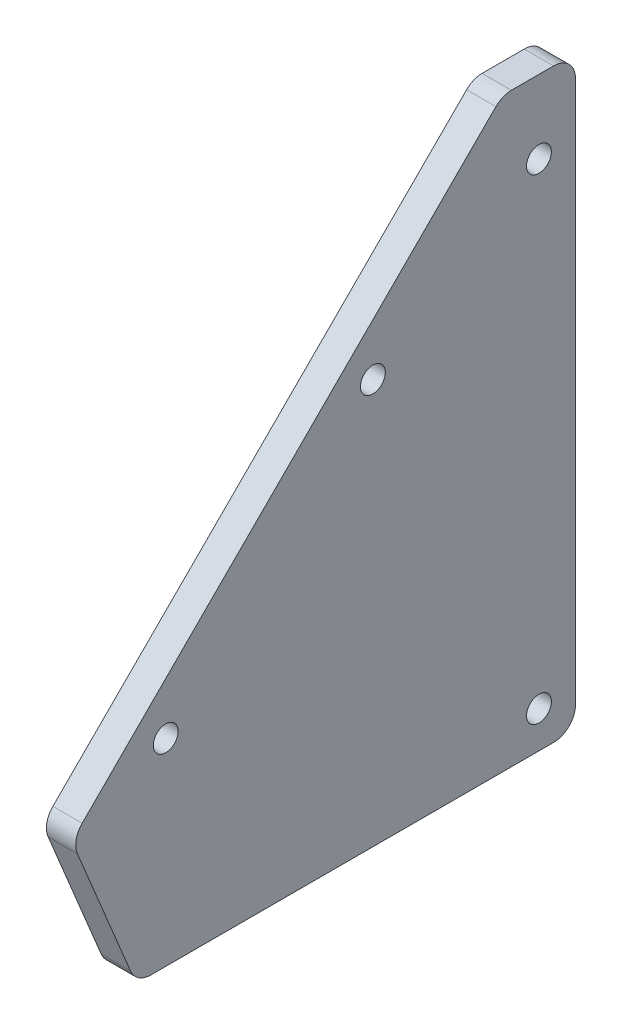
ISO-10303-21;
HEADER;
FILE_DESCRIPTION(('STEP AP214'),'2;1');
FILE_NAME('part.step','',(''),(''),'','','');
FILE_SCHEMA(('AUTOMOTIVE_DESIGN { 1 0 10303 214 1 1 1 1 }'));
ENDSEC;
DATA;
#1=APPLICATION_CONTEXT('core data for automotive mechanical design processes');
#2=APPLICATION_PROTOCOL_DEFINITION('international standard','automotive_design',2000,#1);
#3=PRODUCT_CONTEXT('',#1,'mechanical');
#4=PRODUCT('Part','Part','',(#3));
#5=PRODUCT_RELATED_PRODUCT_CATEGORY('part','',(#4));
#6=PRODUCT_DEFINITION_FORMATION('','',#4);
#7=PRODUCT_DEFINITION_CONTEXT('part definition',#1,'design');
#8=PRODUCT_DEFINITION('design','',#6,#7);
#9=PRODUCT_DEFINITION_SHAPE('','',#8);
#10=(LENGTH_UNIT() NAMED_UNIT(*) SI_UNIT(.MILLI.,.METRE.));
#11=(NAMED_UNIT(*) PLANE_ANGLE_UNIT() SI_UNIT($,.RADIAN.));
#12=(NAMED_UNIT(*) SI_UNIT($,.STERADIAN.) SOLID_ANGLE_UNIT());
#13=UNCERTAINTY_MEASURE_WITH_UNIT(LENGTH_MEASURE(1.E-05),#10,'distance_accuracy_value','');
#14=(GEOMETRIC_REPRESENTATION_CONTEXT(3) GLOBAL_UNCERTAINTY_ASSIGNED_CONTEXT((#13)) GLOBAL_UNIT_ASSIGNED_CONTEXT((#10,
#11,#12)) REPRESENTATION_CONTEXT('',''));
#15=CARTESIAN_POINT('',(0.,0.,0.));
#16=DIRECTION('',(0.,0.,1.));
#17=DIRECTION('',(1.,0.,0.));
#18=AXIS2_PLACEMENT_3D('',#15,#16,#17);
#19=CARTESIAN_POINT('',(4.,0.,0.));
#20=DIRECTION('',(1.,0.,0.));
#21=DIRECTION('',(0.,0.,-1.));
#22=AXIS2_PLACEMENT_3D('',#19,#20,#21);
#23=PLANE('',#22);
#24=CARTESIAN_POINT('',(4.,70.,-85.0000000000008));
#25=DIRECTION('',(1.,0.,0.));
#26=DIRECTION('',(0.,0.,-1.));
#27=AXIS2_PLACEMENT_3D('',#24,#25,#26);
#28=CIRCLE('',#27,1.7);
#29=CARTESIAN_POINT('',(4.,70.,-86.7000000000008));
#30=VERTEX_POINT('',#29);
#31=EDGE_CURVE('E387',#30,#30,#28,.T.);
#32=ORIENTED_EDGE('',*,*,#31,.F.);
#33=EDGE_LOOP('',(#32));
#34=FACE_BOUND('',#33,.T.);
#35=CARTESIAN_POINT('',(4.,55.2512626584709,-62.322330470337));
#36=DIRECTION('',(1.,0.,0.));
#37=DIRECTION('',(0.,0.,-1.));
#38=AXIS2_PLACEMENT_3D('',#35,#36,#37);
#39=CIRCLE('',#38,1.70000000000002);
#40=CARTESIAN_POINT('',(4.,55.2512626584709,-64.0223304703371));
#41=VERTEX_POINT('',#40);
#42=EDGE_CURVE('E155',#41,#41,#39,.T.);
#43=ORIENTED_EDGE('',*,*,#42,.F.);
#44=EDGE_LOOP('',(#43));
#45=FACE_BOUND('',#44,.T.);
#46=DIRECTION('',(0.,0.,1.));
#47=VECTOR('',#46,1.);
#48=CARTESIAN_POINT('',(4.,80.,-80.0000000000008));
#49=LINE('',#48,#47);
#50=CARTESIAN_POINT('',(4.,80.,-87.0000000000008));
#51=VERTEX_POINT('',#50);
#52=CARTESIAN_POINT('',(4.,80.,-81.2426406871201));
#53=VERTEX_POINT('',#52);
#54=EDGE_CURVE('E163',#51,#53,#49,.T.);
#55=ORIENTED_EDGE('',*,*,#54,.T.);
#56=CARTESIAN_POINT('',(4.,77.,-81.2426406871201));
#57=DIRECTION('',(1.,0.,0.));
#58=DIRECTION('',(0.,0.,-1.));
#59=AXIS2_PLACEMENT_3D('',#56,#57,#58);
#60=CIRCLE('',#59,3.);
#61=CARTESIAN_POINT('',(4.,79.1213203435596,-79.1213203435605));
#62=VERTEX_POINT('',#61);
#63=EDGE_CURVE('E189',#53,#62,#60,.T.);
#64=ORIENTED_EDGE('',*,*,#63,.T.);
#65=DIRECTION('',(0.,-0.707106781186544,0.707106781186551));
#66=VECTOR('',#65,1.);
#67=CARTESIAN_POINT('',(4.,80.,-80.0000000000008));
#68=LINE('',#67,#66);
#69=CARTESIAN_POINT('',(4.,22.6306243733465,-22.6306243733468));
#70=VERTEX_POINT('',#69);
#71=EDGE_CURVE('E145',#62,#70,#68,.T.);
#72=ORIENTED_EDGE('',*,*,#71,.T.);
#73=CARTESIAN_POINT('',(4.,20.5093040297869,-24.7519447169064));
#74=DIRECTION('',(1.,0.,0.));
#75=DIRECTION('',(0.,0.,-1.));
#76=AXIS2_PLACEMENT_3D('',#73,#74,#75);
#77=CIRCLE('',#76,3.);
#78=CARTESIAN_POINT('',(4.,19.3612537326916,-21.9803061193725));
#79=VERTEX_POINT('',#78);
#80=EDGE_CURVE('E185',#70,#79,#77,.T.);
#81=ORIENTED_EDGE('',*,*,#80,.T.);
#82=DIRECTION('',(0.,0.923879532511288,0.382683432365088));
#83=VECTOR('',#82,1.);
#84=CARTESIAN_POINT('',(4.,10.6066017177982,-25.6066017177983));
#85=LINE('',#84,#83);
#86=CARTESIAN_POINT('',(4.,1.85194970290474,-29.2328973162241));
#87=VERTEX_POINT('',#86);
#88=EDGE_CURVE('E169',#79,#87,#85,.F.);
#89=ORIENTED_EDGE('',*,*,#88,.T.);
#90=CARTESIAN_POINT('',(4.,3.,-32.0045359137579));
#91=DIRECTION('',(1.,0.,0.));
#92=DIRECTION('',(0.,0.,-1.));
#93=AXIS2_PLACEMENT_3D('',#90,#91,#92);
#94=CIRCLE('',#93,3.);
#95=CARTESIAN_POINT('',(4.,0.,-32.0045359137579));
#96=VERTEX_POINT('',#95);
#97=EDGE_CURVE('E183',#87,#96,#94,.T.);
#98=ORIENTED_EDGE('',*,*,#97,.T.);
#99=DIRECTION('',(0.,0.,-1.));
#100=VECTOR('',#99,1.);
#101=CARTESIAN_POINT('',(4.,0.,0.));
#102=LINE('',#101,#100);
#103=CARTESIAN_POINT('',(4.,0.,-87.0000000000009));
#104=VERTEX_POINT('',#103);
#105=EDGE_CURVE('E209',#96,#104,#102,.T.);
#106=ORIENTED_EDGE('',*,*,#105,.T.);
#107=CARTESIAN_POINT('',(4.,3.,-87.0000000000009));
#108=DIRECTION('',(1.,0.,0.));
#109=DIRECTION('',(0.,0.,-1.));
#110=AXIS2_PLACEMENT_3D('',#107,#108,#109);
#111=CIRCLE('',#110,3.);
#112=CARTESIAN_POINT('',(4.,3.,-90.0000000000009));
#113=VERTEX_POINT('',#112);
#114=EDGE_CURVE('E63',#104,#113,#111,.T.);
#115=ORIENTED_EDGE('',*,*,#114,.T.);
#116=DIRECTION('',(0.,1.,0.));
#117=VECTOR('',#116,1.);
#118=CARTESIAN_POINT('',(4.,80.,-90.0000000000008));
#119=LINE('',#118,#117);
#120=CARTESIAN_POINT('',(4.,77.,-90.0000000000008));
#121=VERTEX_POINT('',#120);
#122=EDGE_CURVE('E212',#113,#121,#119,.T.);
#123=ORIENTED_EDGE('',*,*,#122,.T.);
#124=CARTESIAN_POINT('',(4.,77.,-87.0000000000008));
#125=DIRECTION('',(1.,0.,0.));
#126=DIRECTION('',(0.,0.,-1.));
#127=AXIS2_PLACEMENT_3D('',#124,#125,#126);
#128=CIRCLE('',#127,3.);
#129=EDGE_CURVE('E187',#121,#51,#128,.T.);
#130=ORIENTED_EDGE('',*,*,#129,.T.);
#131=EDGE_LOOP('',(#55,#64,#72,#81,#89,#98,#106,#115,#123,#130));
#132=FACE_BOUND('',#131,.T.);
#133=CARTESIAN_POINT('',(4.,5.,-85.0000000000009));
#134=DIRECTION('',(1.,0.,0.));
#135=DIRECTION('',(0.,0.,-1.));
#136=AXIS2_PLACEMENT_3D('',#133,#134,#135);
#137=CIRCLE('',#136,1.7);
#138=CARTESIAN_POINT('',(4.,5.,-86.7000000000008));
#139=VERTEX_POINT('',#138);
#140=EDGE_CURVE('E379',#139,#139,#137,.T.);
#141=ORIENTED_EDGE('',*,*,#140,.F.);
#142=EDGE_LOOP('',(#141));
#143=FACE_BOUND('',#142,.T.);
#144=CARTESIAN_POINT('',(4.,26.9669914110092,-34.038059222875));
#145=DIRECTION('',(1.,0.,0.));
#146=DIRECTION('',(0.,0.,-1.));
#147=AXIS2_PLACEMENT_3D('',#144,#145,#146);
#148=CIRCLE('',#147,1.70000000000002);
#149=CARTESIAN_POINT('',(4.,26.9669914110092,-35.738059222875));
#150=VERTEX_POINT('',#149);
#151=EDGE_CURVE('E395',#150,#150,#148,.T.);
#152=ORIENTED_EDGE('',*,*,#151,.F.);
#153=EDGE_LOOP('',(#152));
#154=FACE_BOUND('',#153,.T.);
#155=ADVANCED_FACE('F43',(#34,#45,#132,#143,#154),#23,.T.);
#156=CARTESIAN_POINT('',(0.,0.,0.));
#157=DIRECTION('',(1.,0.,0.));
#158=DIRECTION('',(0.,0.,-1.));
#159=AXIS2_PLACEMENT_3D('',#156,#157,#158);
#160=PLANE('',#159);
#161=DIRECTION('',(0.,-0.707106781186544,0.707106781186551));
#162=VECTOR('',#161,1.);
#163=CARTESIAN_POINT('',(0.,80.,-80.0000000000008));
#164=LINE('',#163,#162);
#165=CARTESIAN_POINT('',(0.,79.1213203435596,-79.1213203435605));
#166=VERTEX_POINT('',#165);
#167=CARTESIAN_POINT('',(0.,22.6306243733465,-22.6306243733468));
#168=VERTEX_POINT('',#167);
#169=EDGE_CURVE('E137',#166,#168,#164,.T.);
#170=ORIENTED_EDGE('',*,*,#169,.F.);
#171=CARTESIAN_POINT('',(0.,77.,-81.2426406871201));
#172=DIRECTION('',(1.,0.,0.));
#173=DIRECTION('',(0.,0.,-1.));
#174=AXIS2_PLACEMENT_3D('',#171,#172,#173);
#175=CIRCLE('',#174,3.);
#176=CARTESIAN_POINT('',(0.,80.,-81.2426406871201));
#177=VERTEX_POINT('',#176);
#178=EDGE_CURVE('E122',#166,#177,#175,.F.);
#179=ORIENTED_EDGE('',*,*,#178,.T.);
#180=DIRECTION('',(0.,0.,1.));
#181=VECTOR('',#180,1.);
#182=CARTESIAN_POINT('',(0.,80.,-80.0000000000008));
#183=LINE('',#182,#181);
#184=CARTESIAN_POINT('',(0.,80.,-87.0000000000008));
#185=VERTEX_POINT('',#184);
#186=EDGE_CURVE('E164',#185,#177,#183,.T.);
#187=ORIENTED_EDGE('',*,*,#186,.F.);
#188=CARTESIAN_POINT('',(0.,77.,-87.0000000000008));
#189=DIRECTION('',(1.,0.,0.));
#190=DIRECTION('',(0.,0.,-1.));
#191=AXIS2_PLACEMENT_3D('',#188,#189,#190);
#192=CIRCLE('',#191,3.);
#193=CARTESIAN_POINT('',(0.,77.,-90.0000000000008));
#194=VERTEX_POINT('',#193);
#195=EDGE_CURVE('E135',#185,#194,#192,.F.);
#196=ORIENTED_EDGE('',*,*,#195,.T.);
#197=DIRECTION('',(0.,1.,0.));
#198=VECTOR('',#197,1.);
#199=CARTESIAN_POINT('',(0.,80.,-90.0000000000008));
#200=LINE('',#199,#198);
#201=CARTESIAN_POINT('',(0.,3.,-90.0000000000009));
#202=VERTEX_POINT('',#201);
#203=EDGE_CURVE('E151',#202,#194,#200,.T.);
#204=ORIENTED_EDGE('',*,*,#203,.F.);
#205=CARTESIAN_POINT('',(0.,3.,-87.0000000000009));
#206=DIRECTION('',(1.,0.,0.));
#207=DIRECTION('',(0.,0.,-1.));
#208=AXIS2_PLACEMENT_3D('',#205,#206,#207);
#209=CIRCLE('',#208,3.);
#210=CARTESIAN_POINT('',(0.,0.,-87.0000000000009));
#211=VERTEX_POINT('',#210);
#212=EDGE_CURVE('E141',#202,#211,#209,.F.);
#213=ORIENTED_EDGE('',*,*,#212,.T.);
#214=DIRECTION('',(0.,0.,-1.));
#215=VECTOR('',#214,1.);
#216=CARTESIAN_POINT('',(0.,0.,-90.0000000000009));
#217=LINE('',#216,#215);
#218=CARTESIAN_POINT('',(0.,0.,-32.0045359137579));
#219=VERTEX_POINT('',#218);
#220=EDGE_CURVE('E152',#219,#211,#217,.T.);
#221=ORIENTED_EDGE('',*,*,#220,.F.);
#222=CARTESIAN_POINT('',(0.,3.,-32.0045359137579));
#223=DIRECTION('',(1.,0.,0.));
#224=DIRECTION('',(0.,0.,-1.));
#225=AXIS2_PLACEMENT_3D('',#222,#223,#224);
#226=CIRCLE('',#225,3.);
#227=CARTESIAN_POINT('',(0.,1.85194970290474,-29.2328973162241));
#228=VERTEX_POINT('',#227);
#229=EDGE_CURVE('E174',#219,#228,#226,.F.);
#230=ORIENTED_EDGE('',*,*,#229,.T.);
#231=DIRECTION('',(0.,-0.923879532511288,-0.382683432365088));
#232=VECTOR('',#231,1.);
#233=CARTESIAN_POINT('',(0.,0.,-30.));
#234=LINE('',#233,#232);
#235=CARTESIAN_POINT('',(0.,19.3612537326916,-21.9803061193725));
#236=VERTEX_POINT('',#235);
#237=EDGE_CURVE('E170',#228,#236,#234,.F.);
#238=ORIENTED_EDGE('',*,*,#237,.T.);
#239=CARTESIAN_POINT('',(0.,20.5093040297869,-24.7519447169064));
#240=DIRECTION('',(1.,0.,0.));
#241=DIRECTION('',(0.,0.,-1.));
#242=AXIS2_PLACEMENT_3D('',#239,#240,#241);
#243=CIRCLE('',#242,3.);
#244=EDGE_CURVE('E148',#236,#168,#243,.F.);
#245=ORIENTED_EDGE('',*,*,#244,.T.);
#246=EDGE_LOOP('',(#170,#179,#187,#196,#204,#213,#221,#230,#238,#245));
#247=FACE_BOUND('',#246,.T.);
#248=CARTESIAN_POINT('',(0.,55.2512626584709,-62.322330470337));
#249=DIRECTION('',(1.,0.,0.));
#250=DIRECTION('',(0.,0.,-1.));
#251=AXIS2_PLACEMENT_3D('',#248,#249,#250);
#252=CIRCLE('',#251,1.70000000000002);
#253=CARTESIAN_POINT('',(0.,55.2512626584709,-64.0223304703371));
#254=VERTEX_POINT('',#253);
#255=EDGE_CURVE('E158',#254,#254,#252,.T.);
#256=ORIENTED_EDGE('',*,*,#255,.T.);
#257=EDGE_LOOP('',(#256));
#258=FACE_BOUND('',#257,.T.);
#259=CARTESIAN_POINT('',(0.,5.,-85.0000000000009));
#260=DIRECTION('',(1.,0.,0.));
#261=DIRECTION('',(0.,0.,-1.));
#262=AXIS2_PLACEMENT_3D('',#259,#260,#261);
#263=CIRCLE('',#262,1.7);
#264=CARTESIAN_POINT('',(0.,5.,-86.7000000000008));
#265=VERTEX_POINT('',#264);
#266=EDGE_CURVE('E385',#265,#265,#263,.T.);
#267=ORIENTED_EDGE('',*,*,#266,.T.);
#268=EDGE_LOOP('',(#267));
#269=FACE_BOUND('',#268,.T.);
#270=CARTESIAN_POINT('',(0.,70.,-85.0000000000008));
#271=DIRECTION('',(1.,0.,0.));
#272=DIRECTION('',(0.,0.,-1.));
#273=AXIS2_PLACEMENT_3D('',#270,#271,#272);
#274=CIRCLE('',#273,1.7);
#275=CARTESIAN_POINT('',(0.,70.,-86.7000000000008));
#276=VERTEX_POINT('',#275);
#277=EDGE_CURVE('E386',#276,#276,#274,.T.);
#278=ORIENTED_EDGE('',*,*,#277,.T.);
#279=EDGE_LOOP('',(#278));
#280=FACE_BOUND('',#279,.T.);
#281=CARTESIAN_POINT('',(0.,26.9669914110092,-34.038059222875));
#282=DIRECTION('',(1.,0.,0.));
#283=DIRECTION('',(0.,0.,-1.));
#284=AXIS2_PLACEMENT_3D('',#281,#282,#283);
#285=CIRCLE('',#284,1.70000000000002);
#286=CARTESIAN_POINT('',(0.,26.9669914110092,-35.738059222875));
#287=VERTEX_POINT('',#286);
#288=EDGE_CURVE('E391',#287,#287,#285,.T.);
#289=ORIENTED_EDGE('',*,*,#288,.T.);
#290=EDGE_LOOP('',(#289));
#291=FACE_BOUND('',#290,.T.);
#292=ADVANCED_FACE('F147',(#247,#258,#269,#280,#291),#160,.F.);
#293=CARTESIAN_POINT('',(4.,80.,-80.0000000000008));
#294=DIRECTION('',(0.,-0.707106781186551,-0.707106781186544));
#295=DIRECTION('',(0.,0.707106781186544,-0.707106781186551));
#296=AXIS2_PLACEMENT_3D('',#293,#294,#295);
#297=PLANE('',#296);
#298=ORIENTED_EDGE('',*,*,#71,.F.);
#299=DIRECTION('',(-1.,0.,0.));
#300=VECTOR('',#299,1.);
#301=CARTESIAN_POINT('',(4.,79.1213203435596,-79.1213203435605));
#302=LINE('',#301,#300);
#303=EDGE_CURVE('E123',#62,#166,#302,.T.);
#304=ORIENTED_EDGE('',*,*,#303,.T.);
#305=ORIENTED_EDGE('',*,*,#169,.T.);
#306=DIRECTION('',(-1.,0.,0.));
#307=VECTOR('',#306,1.);
#308=CARTESIAN_POINT('',(4.,22.6306243733465,-22.6306243733467));
#309=LINE('',#308,#307);
#310=EDGE_CURVE('E144',#168,#70,#309,.F.);
#311=ORIENTED_EDGE('',*,*,#310,.T.);
#312=EDGE_LOOP('',(#298,#304,#305,#311));
#313=FACE_BOUND('',#312,.T.);
#314=ADVANCED_FACE('F140',(#313),#297,.F.);
#315=CARTESIAN_POINT('',(4.,0.,-90.0000000000009));
#316=DIRECTION('',(0.,1.,0.));
#317=DIRECTION('',(0.,0.,1.));
#318=AXIS2_PLACEMENT_3D('',#315,#316,#317);
#319=PLANE('',#318);
#320=ORIENTED_EDGE('',*,*,#105,.F.);
#321=DIRECTION('',(1.,0.,0.));
#322=VECTOR('',#321,1.);
#323=CARTESIAN_POINT('',(0.,0.,-32.0045359137579));
#324=LINE('',#323,#322);
#325=EDGE_CURVE('E197',#96,#219,#324,.F.);
#326=ORIENTED_EDGE('',*,*,#325,.T.);
#327=ORIENTED_EDGE('',*,*,#220,.T.);
#328=DIRECTION('',(-1.,0.,0.));
#329=VECTOR('',#328,1.);
#330=CARTESIAN_POINT('',(4.,0.,-87.0000000000009));
#331=LINE('',#330,#329);
#332=EDGE_CURVE('E191',#211,#104,#331,.F.);
#333=ORIENTED_EDGE('',*,*,#332,.T.);
#334=EDGE_LOOP('',(#320,#326,#327,#333));
#335=FACE_BOUND('',#334,.T.);
#336=ADVANCED_FACE('F226',(#335),#319,.F.);
#337=CARTESIAN_POINT('',(4.,80.,-90.0000000000008));
#338=DIRECTION('',(0.,0.,1.));
#339=DIRECTION('',(0.,-1.,0.));
#340=AXIS2_PLACEMENT_3D('',#337,#338,#339);
#341=PLANE('',#340);
#342=ORIENTED_EDGE('',*,*,#203,.T.);
#343=DIRECTION('',(-1.,0.,0.));
#344=VECTOR('',#343,1.);
#345=CARTESIAN_POINT('',(4.,77.,-90.0000000000008));
#346=LINE('',#345,#344);
#347=EDGE_CURVE('E59',#194,#121,#346,.F.);
#348=ORIENTED_EDGE('',*,*,#347,.T.);
#349=ORIENTED_EDGE('',*,*,#122,.F.);
#350=DIRECTION('',(-1.,0.,0.));
#351=VECTOR('',#350,1.);
#352=CARTESIAN_POINT('',(4.,3.,-90.0000000000009));
#353=LINE('',#352,#351);
#354=EDGE_CURVE('E188',#113,#202,#353,.T.);
#355=ORIENTED_EDGE('',*,*,#354,.T.);
#356=EDGE_LOOP('',(#342,#348,#349,#355));
#357=FACE_BOUND('',#356,.T.);
#358=ADVANCED_FACE('F225',(#357),#341,.F.);
#359=CARTESIAN_POINT('',(4.,80.,-80.0000000000008));
#360=DIRECTION('',(0.,-1.,0.));
#361=DIRECTION('',(0.,0.,-1.));
#362=AXIS2_PLACEMENT_3D('',#359,#360,#361);
#363=PLANE('',#362);
#364=ORIENTED_EDGE('',*,*,#186,.T.);
#365=DIRECTION('',(-1.,0.,0.));
#366=VECTOR('',#365,1.);
#367=CARTESIAN_POINT('',(4.,80.,-81.2426406871201));
#368=LINE('',#367,#366);
#369=EDGE_CURVE('E127',#177,#53,#368,.F.);
#370=ORIENTED_EDGE('',*,*,#369,.T.);
#371=ORIENTED_EDGE('',*,*,#54,.F.);
#372=DIRECTION('',(-1.,0.,0.));
#373=VECTOR('',#372,1.);
#374=CARTESIAN_POINT('',(4.,80.,-87.0000000000008));
#375=LINE('',#374,#373);
#376=EDGE_CURVE('E132',#51,#185,#375,.T.);
#377=ORIENTED_EDGE('',*,*,#376,.T.);
#378=EDGE_LOOP('',(#364,#370,#371,#377));
#379=FACE_BOUND('',#378,.T.);
#380=ADVANCED_FACE('F218',(#379),#363,.F.);
#381=CARTESIAN_POINT('',(4.,55.2512626584709,-62.322330470337));
#382=DIRECTION('',(-1.,0.,0.));
#383=DIRECTION('',(0.,0.,1.));
#384=AXIS2_PLACEMENT_3D('',#381,#382,#383);
#385=CYLINDRICAL_SURFACE('',#384,1.70000000000002);
#386=ORIENTED_EDGE('',*,*,#42,.T.);
#387=EDGE_LOOP('',(#386));
#388=FACE_BOUND('',#387,.T.);
#389=ORIENTED_EDGE('',*,*,#255,.F.);
#390=EDGE_LOOP('',(#389));
#391=FACE_BOUND('',#390,.T.);
#392=ADVANCED_FACE('F252',(#388,#391),#385,.F.);
#393=CARTESIAN_POINT('',(4.,5.,-85.0000000000009));
#394=DIRECTION('',(-1.,0.,0.));
#395=DIRECTION('',(0.,0.,1.));
#396=AXIS2_PLACEMENT_3D('',#393,#394,#395);
#397=CYLINDRICAL_SURFACE('',#396,1.7);
#398=ORIENTED_EDGE('',*,*,#140,.T.);
#399=EDGE_LOOP('',(#398));
#400=FACE_BOUND('',#399,.T.);
#401=ORIENTED_EDGE('',*,*,#266,.F.);
#402=EDGE_LOOP('',(#401));
#403=FACE_BOUND('',#402,.T.);
#404=ADVANCED_FACE('F320',(#400,#403),#397,.F.);
#405=CARTESIAN_POINT('',(4.,70.,-85.0000000000008));
#406=DIRECTION('',(-1.,0.,0.));
#407=DIRECTION('',(0.,0.,1.));
#408=AXIS2_PLACEMENT_3D('',#405,#406,#407);
#409=CYLINDRICAL_SURFACE('',#408,1.7);
#410=ORIENTED_EDGE('',*,*,#31,.T.);
#411=EDGE_LOOP('',(#410));
#412=FACE_BOUND('',#411,.T.);
#413=ORIENTED_EDGE('',*,*,#277,.F.);
#414=EDGE_LOOP('',(#413));
#415=FACE_BOUND('',#414,.T.);
#416=ADVANCED_FACE('F308',(#412,#415),#409,.F.);
#417=CARTESIAN_POINT('',(4.,26.9669914110092,-34.038059222875));
#418=DIRECTION('',(-1.,0.,0.));
#419=DIRECTION('',(0.,0.,1.));
#420=AXIS2_PLACEMENT_3D('',#417,#418,#419);
#421=CYLINDRICAL_SURFACE('',#420,1.70000000000002);
#422=ORIENTED_EDGE('',*,*,#151,.T.);
#423=EDGE_LOOP('',(#422));
#424=FACE_BOUND('',#423,.T.);
#425=ORIENTED_EDGE('',*,*,#288,.F.);
#426=EDGE_LOOP('',(#425));
#427=FACE_BOUND('',#426,.T.);
#428=ADVANCED_FACE('F270',(#424,#427),#421,.F.);
#429=CARTESIAN_POINT('',(4.,0.,-30.));
#430=DIRECTION('',(0.,0.382683432365088,-0.923879532511288));
#431=DIRECTION('',(-1.,0.,0.));
#432=AXIS2_PLACEMENT_3D('',#429,#430,#431);
#433=PLANE('',#432);
#434=ORIENTED_EDGE('',*,*,#237,.F.);
#435=DIRECTION('',(-1.,0.,0.));
#436=VECTOR('',#435,1.);
#437=CARTESIAN_POINT('',(4.,1.85194970290474,-29.2328973162241));
#438=LINE('',#437,#436);
#439=EDGE_CURVE('E11',#228,#87,#438,.F.);
#440=ORIENTED_EDGE('',*,*,#439,.T.);
#441=ORIENTED_EDGE('',*,*,#88,.F.);
#442=DIRECTION('',(1.,0.,0.));
#443=VECTOR('',#442,1.);
#444=CARTESIAN_POINT('',(0.,19.3612537326916,-21.9803061193725));
#445=LINE('',#444,#443);
#446=EDGE_CURVE('E51',#79,#236,#445,.F.);
#447=ORIENTED_EDGE('',*,*,#446,.T.);
#448=EDGE_LOOP('',(#434,#440,#441,#447));
#449=FACE_BOUND('',#448,.T.);
#450=ADVANCED_FACE('F205',(#449),#433,.F.);
#451=CARTESIAN_POINT('',(4.,77.,-81.2426406871201));
#452=DIRECTION('',(-1.,0.,0.));
#453=DIRECTION('',(0.,0.,1.));
#454=AXIS2_PLACEMENT_3D('',#451,#452,#453);
#455=CYLINDRICAL_SURFACE('',#454,3.);
#456=ORIENTED_EDGE('',*,*,#63,.F.);
#457=ORIENTED_EDGE('',*,*,#369,.F.);
#458=ORIENTED_EDGE('',*,*,#178,.F.);
#459=ORIENTED_EDGE('',*,*,#303,.F.);
#460=EDGE_LOOP('',(#456,#457,#458,#459));
#461=FACE_BOUND('',#460,.T.);
#462=ADVANCED_FACE('F121',(#461),#455,.T.);
#463=CARTESIAN_POINT('',(4.,77.,-87.0000000000008));
#464=DIRECTION('',(-1.,0.,0.));
#465=DIRECTION('',(0.,0.,1.));
#466=AXIS2_PLACEMENT_3D('',#463,#464,#465);
#467=CYLINDRICAL_SURFACE('',#466,3.);
#468=ORIENTED_EDGE('',*,*,#129,.F.);
#469=ORIENTED_EDGE('',*,*,#347,.F.);
#470=ORIENTED_EDGE('',*,*,#195,.F.);
#471=ORIENTED_EDGE('',*,*,#376,.F.);
#472=EDGE_LOOP('',(#468,#469,#470,#471));
#473=FACE_BOUND('',#472,.T.);
#474=ADVANCED_FACE('F216',(#473),#467,.T.);
#475=CARTESIAN_POINT('',(4.,3.,-32.0045359137579));
#476=DIRECTION('',(-1.,0.,0.));
#477=DIRECTION('',(0.,0.,1.));
#478=AXIS2_PLACEMENT_3D('',#475,#476,#477);
#479=CYLINDRICAL_SURFACE('',#478,3.);
#480=ORIENTED_EDGE('',*,*,#97,.F.);
#481=ORIENTED_EDGE('',*,*,#439,.F.);
#482=ORIENTED_EDGE('',*,*,#229,.F.);
#483=ORIENTED_EDGE('',*,*,#325,.F.);
#484=EDGE_LOOP('',(#480,#481,#482,#483));
#485=FACE_BOUND('',#484,.T.);
#486=ADVANCED_FACE('F235',(#485),#479,.T.);
#487=CARTESIAN_POINT('',(4.,20.5093040297869,-24.7519447169064));
#488=DIRECTION('',(1.,0.,0.));
#489=DIRECTION('',(0.,0.,-1.));
#490=AXIS2_PLACEMENT_3D('',#487,#488,#489);
#491=CYLINDRICAL_SURFACE('',#490,3.);
#492=ORIENTED_EDGE('',*,*,#244,.F.);
#493=ORIENTED_EDGE('',*,*,#446,.F.);
#494=ORIENTED_EDGE('',*,*,#80,.F.);
#495=ORIENTED_EDGE('',*,*,#310,.F.);
#496=EDGE_LOOP('',(#492,#493,#494,#495));
#497=FACE_BOUND('',#496,.T.);
#498=ADVANCED_FACE('F207',(#497),#491,.T.);
#499=CARTESIAN_POINT('',(4.,3.,-87.0000000000009));
#500=DIRECTION('',(-1.,0.,0.));
#501=DIRECTION('',(0.,0.,1.));
#502=AXIS2_PLACEMENT_3D('',#499,#500,#501);
#503=CYLINDRICAL_SURFACE('',#502,3.);
#504=ORIENTED_EDGE('',*,*,#114,.F.);
#505=ORIENTED_EDGE('',*,*,#332,.F.);
#506=ORIENTED_EDGE('',*,*,#212,.F.);
#507=ORIENTED_EDGE('',*,*,#354,.F.);
#508=EDGE_LOOP('',(#504,#505,#506,#507));
#509=FACE_BOUND('',#508,.T.);
#510=ADVANCED_FACE('F44',(#509),#503,.T.);
#511=CLOSED_SHELL('',(#155,#292,#314,#336,#358,#380,#392,#404,#416,#428,#450,#462,#474,#486,
#498,#510));
#512=MANIFOLD_SOLID_BREP('B2',#511);
#513=ADVANCED_BREP_SHAPE_REPRESENTATION('',(#18,#512),#14);
#514=SHAPE_DEFINITION_REPRESENTATION(#9,#513);
ENDSEC;
END-ISO-10303-21;
